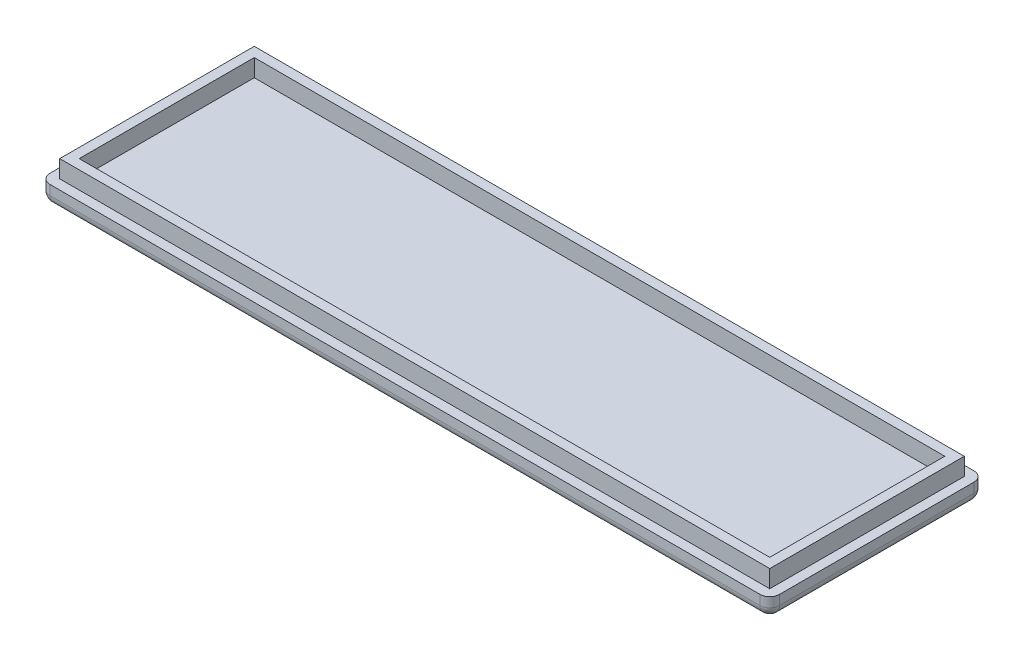
ISO-10303-21;
HEADER;
FILE_DESCRIPTION(('STEP AP214'),'2;1');
FILE_NAME('part.step','',(''),(''),'','','');
FILE_SCHEMA(('AUTOMOTIVE_DESIGN { 1 0 10303 214 1 1 1 1 }'));
ENDSEC;
DATA;
#1=APPLICATION_CONTEXT('core data for automotive mechanical design processes');
#2=APPLICATION_PROTOCOL_DEFINITION('international standard','automotive_design',2000,#1);
#3=PRODUCT_CONTEXT('',#1,'mechanical');
#4=PRODUCT('Part','Part','',(#3));
#5=PRODUCT_RELATED_PRODUCT_CATEGORY('part','',(#4));
#6=PRODUCT_DEFINITION_FORMATION('','',#4);
#7=PRODUCT_DEFINITION_CONTEXT('part definition',#1,'design');
#8=PRODUCT_DEFINITION('design','',#6,#7);
#9=PRODUCT_DEFINITION_SHAPE('','',#8);
#10=(LENGTH_UNIT() NAMED_UNIT(*) SI_UNIT(.MILLI.,.METRE.));
#11=(NAMED_UNIT(*) PLANE_ANGLE_UNIT() SI_UNIT($,.RADIAN.));
#12=(NAMED_UNIT(*) SI_UNIT($,.STERADIAN.) SOLID_ANGLE_UNIT());
#13=UNCERTAINTY_MEASURE_WITH_UNIT(LENGTH_MEASURE(1.E-05),#10,'distance_accuracy_value','');
#14=(GEOMETRIC_REPRESENTATION_CONTEXT(3) GLOBAL_UNCERTAINTY_ASSIGNED_CONTEXT((#13)) GLOBAL_UNIT_ASSIGNED_CONTEXT((#10,
#11,#12)) REPRESENTATION_CONTEXT('',''));
#15=CARTESIAN_POINT('',(0.,0.,0.));
#16=DIRECTION('',(0.,0.,1.));
#17=DIRECTION('',(1.,0.,0.));
#18=AXIS2_PLACEMENT_3D('',#15,#16,#17);
#19=CARTESIAN_POINT('',(0.,2.,0.));
#20=DIRECTION('',(0.,-1.,0.));
#21=DIRECTION('',(0.,0.,-1.));
#22=AXIS2_PLACEMENT_3D('',#19,#20,#21);
#23=PLANE('',#22);
#24=DIRECTION('',(1.,0.,0.));
#25=VECTOR('',#24,1.);
#26=CARTESIAN_POINT('',(-37.5,2.,11.));
#27=LINE('',#26,#25);
#28=CARTESIAN_POINT('',(-36.5,2.,11.));
#29=VERTEX_POINT('',#28);
#30=CARTESIAN_POINT('',(36.5,2.,11.));
#31=VERTEX_POINT('',#30);
#32=EDGE_CURVE('E281',#29,#31,#27,.T.);
#33=ORIENTED_EDGE('',*,*,#32,.T.);
#34=CARTESIAN_POINT('',(36.5,2.,10.));
#35=DIRECTION('',(0.,-1.,0.));
#36=DIRECTION('',(0.,0.,-1.));
#37=AXIS2_PLACEMENT_3D('',#34,#35,#36);
#38=CIRCLE('',#37,1.);
#39=CARTESIAN_POINT('',(37.5,2.,10.));
#40=VERTEX_POINT('',#39);
#41=EDGE_CURVE('E11',#31,#40,#38,.F.);
#42=ORIENTED_EDGE('',*,*,#41,.T.);
#43=DIRECTION('',(0.,0.,-1.));
#44=VECTOR('',#43,1.);
#45=CARTESIAN_POINT('',(37.5,2.,11.));
#46=LINE('',#45,#44);
#47=CARTESIAN_POINT('',(37.5,2.,-10.));
#48=VERTEX_POINT('',#47);
#49=EDGE_CURVE('E269',#40,#48,#46,.T.);
#50=ORIENTED_EDGE('',*,*,#49,.T.);
#51=CARTESIAN_POINT('',(36.5,2.,-10.));
#52=DIRECTION('',(0.,-1.,0.));
#53=DIRECTION('',(0.,0.,-1.));
#54=AXIS2_PLACEMENT_3D('',#51,#52,#53);
#55=CIRCLE('',#54,1.);
#56=CARTESIAN_POINT('',(36.5,2.,-11.));
#57=VERTEX_POINT('',#56);
#58=EDGE_CURVE('E53',#48,#57,#55,.F.);
#59=ORIENTED_EDGE('',*,*,#58,.T.);
#60=DIRECTION('',(-1.,0.,0.));
#61=VECTOR('',#60,1.);
#62=CARTESIAN_POINT('',(-37.5,2.,-11.));
#63=LINE('',#62,#61);
#64=CARTESIAN_POINT('',(-36.5,2.,-11.));
#65=VERTEX_POINT('',#64);
#66=EDGE_CURVE('E273',#57,#65,#63,.T.);
#67=ORIENTED_EDGE('',*,*,#66,.T.);
#68=CARTESIAN_POINT('',(-36.5,2.,-10.));
#69=DIRECTION('',(0.,-1.,0.));
#70=DIRECTION('',(0.,0.,-1.));
#71=AXIS2_PLACEMENT_3D('',#68,#69,#70);
#72=CIRCLE('',#71,1.);
#73=CARTESIAN_POINT('',(-37.5,2.,-10.));
#74=VERTEX_POINT('',#73);
#75=EDGE_CURVE('E336',#65,#74,#72,.F.);
#76=ORIENTED_EDGE('',*,*,#75,.T.);
#77=DIRECTION('',(0.,0.,1.));
#78=VECTOR('',#77,1.);
#79=CARTESIAN_POINT('',(-37.5,2.,11.));
#80=LINE('',#79,#78);
#81=CARTESIAN_POINT('',(-37.5,2.,10.));
#82=VERTEX_POINT('',#81);
#83=EDGE_CURVE('E277',#74,#82,#80,.T.);
#84=ORIENTED_EDGE('',*,*,#83,.T.);
#85=CARTESIAN_POINT('',(-36.5,2.,10.));
#86=DIRECTION('',(0.,-1.,0.));
#87=DIRECTION('',(0.,0.,-1.));
#88=AXIS2_PLACEMENT_3D('',#85,#86,#87);
#89=CIRCLE('',#88,1.);
#90=EDGE_CURVE('E333',#82,#29,#89,.F.);
#91=ORIENTED_EDGE('',*,*,#90,.T.);
#92=EDGE_LOOP('',(#33,#42,#50,#59,#67,#76,#84,#91));
#93=FACE_BOUND('',#92,.T.);
#94=DIRECTION('',(0.,0.,-1.));
#95=VECTOR('',#94,1.);
#96=CARTESIAN_POINT('',(36.5,2.,10.));
#97=LINE('',#96,#95);
#98=CARTESIAN_POINT('',(36.5,2.,10.));
#99=VERTEX_POINT('',#98);
#100=CARTESIAN_POINT('',(36.5,2.,-10.));
#101=VERTEX_POINT('',#100);
#102=EDGE_CURVE('E191',#99,#101,#97,.T.);
#103=ORIENTED_EDGE('',*,*,#102,.F.);
#104=DIRECTION('',(1.,0.,0.));
#105=VECTOR('',#104,1.);
#106=CARTESIAN_POINT('',(-36.5,2.,10.));
#107=LINE('',#106,#105);
#108=CARTESIAN_POINT('',(-36.5,2.,10.));
#109=VERTEX_POINT('',#108);
#110=EDGE_CURVE('E230',#109,#99,#107,.T.);
#111=ORIENTED_EDGE('',*,*,#110,.F.);
#112=DIRECTION('',(0.,0.,1.));
#113=VECTOR('',#112,1.);
#114=CARTESIAN_POINT('',(-36.5,2.,10.));
#115=LINE('',#114,#113);
#116=CARTESIAN_POINT('',(-36.5,2.,-10.));
#117=VERTEX_POINT('',#116);
#118=EDGE_CURVE('E247',#117,#109,#115,.T.);
#119=ORIENTED_EDGE('',*,*,#118,.F.);
#120=DIRECTION('',(-1.,0.,0.));
#121=VECTOR('',#120,1.);
#122=CARTESIAN_POINT('',(-36.5,2.,-10.));
#123=LINE('',#122,#121);
#124=EDGE_CURVE('E243',#101,#117,#123,.T.);
#125=ORIENTED_EDGE('',*,*,#124,.F.);
#126=EDGE_LOOP('',(#103,#111,#119,#125));
#127=FACE_BOUND('',#126,.T.);
#128=ADVANCED_FACE('F43',(#93,#127),#23,.F.);
#129=CARTESIAN_POINT('',(37.5,2.,11.));
#130=DIRECTION('',(-1.,0.,0.));
#131=DIRECTION('',(0.,0.,1.));
#132=AXIS2_PLACEMENT_3D('',#129,#130,#131);
#133=PLANE('',#132);
#134=ORIENTED_EDGE('',*,*,#49,.F.);
#135=DIRECTION('',(0.,-1.,0.));
#136=VECTOR('',#135,1.);
#137=CARTESIAN_POINT('',(37.5,2.,10.));
#138=LINE('',#137,#136);
#139=CARTESIAN_POINT('',(37.5,1.,10.));
#140=VERTEX_POINT('',#139);
#141=EDGE_CURVE('E61',#40,#140,#138,.T.);
#142=ORIENTED_EDGE('',*,*,#141,.T.);
#143=DIRECTION('',(0.,0.,-1.));
#144=VECTOR('',#143,1.);
#145=CARTESIAN_POINT('',(37.5,1.,-11.));
#146=LINE('',#145,#144);
#147=CARTESIAN_POINT('',(37.5,1.,-10.));
#148=VERTEX_POINT('',#147);
#149=EDGE_CURVE('E66',#140,#148,#146,.T.);
#150=ORIENTED_EDGE('',*,*,#149,.T.);
#151=DIRECTION('',(0.,-1.,0.));
#152=VECTOR('',#151,1.);
#153=CARTESIAN_POINT('',(37.5,2.,-10.));
#154=LINE('',#153,#152);
#155=EDGE_CURVE('E326',#148,#48,#154,.F.);
#156=ORIENTED_EDGE('',*,*,#155,.T.);
#157=EDGE_LOOP('',(#134,#142,#150,#156));
#158=FACE_BOUND('',#157,.T.);
#159=ADVANCED_FACE('F403',(#158),#133,.F.);
#160=CARTESIAN_POINT('',(-37.5,2.,-11.));
#161=DIRECTION('',(0.,0.,1.));
#162=DIRECTION('',(1.,0.,0.));
#163=AXIS2_PLACEMENT_3D('',#160,#161,#162);
#164=PLANE('',#163);
#165=ORIENTED_EDGE('',*,*,#66,.F.);
#166=DIRECTION('',(0.,-1.,0.));
#167=VECTOR('',#166,1.);
#168=CARTESIAN_POINT('',(36.5,2.,-11.));
#169=LINE('',#168,#167);
#170=CARTESIAN_POINT('',(36.5,1.,-11.));
#171=VERTEX_POINT('',#170);
#172=EDGE_CURVE('E292',#57,#171,#169,.T.);
#173=ORIENTED_EDGE('',*,*,#172,.T.);
#174=DIRECTION('',(-1.,0.,0.));
#175=VECTOR('',#174,1.);
#176=CARTESIAN_POINT('',(-37.5,1.,-11.));
#177=LINE('',#176,#175);
#178=CARTESIAN_POINT('',(-36.5,1.,-11.));
#179=VERTEX_POINT('',#178);
#180=EDGE_CURVE('E288',#171,#179,#177,.T.);
#181=ORIENTED_EDGE('',*,*,#180,.T.);
#182=DIRECTION('',(0.,-1.,0.));
#183=VECTOR('',#182,1.);
#184=CARTESIAN_POINT('',(-36.5,2.,-11.));
#185=LINE('',#184,#183);
#186=EDGE_CURVE('E285',#179,#65,#185,.F.);
#187=ORIENTED_EDGE('',*,*,#186,.T.);
#188=EDGE_LOOP('',(#165,#173,#181,#187));
#189=FACE_BOUND('',#188,.T.);
#190=ADVANCED_FACE('F444',(#189),#164,.F.);
#191=CARTESIAN_POINT('',(-37.5,2.,11.));
#192=DIRECTION('',(1.,0.,0.));
#193=DIRECTION('',(0.,0.,-1.));
#194=AXIS2_PLACEMENT_3D('',#191,#192,#193);
#195=PLANE('',#194);
#196=ORIENTED_EDGE('',*,*,#83,.F.);
#197=DIRECTION('',(0.,-1.,0.));
#198=VECTOR('',#197,1.);
#199=CARTESIAN_POINT('',(-37.5,2.,-10.));
#200=LINE('',#199,#198);
#201=CARTESIAN_POINT('',(-37.5,1.,-10.));
#202=VERTEX_POINT('',#201);
#203=EDGE_CURVE('E314',#74,#202,#200,.T.);
#204=ORIENTED_EDGE('',*,*,#203,.T.);
#205=DIRECTION('',(0.,0.,1.));
#206=VECTOR('',#205,1.);
#207=CARTESIAN_POINT('',(-37.5,1.,11.));
#208=LINE('',#207,#206);
#209=CARTESIAN_POINT('',(-37.5,1.,10.));
#210=VERTEX_POINT('',#209);
#211=EDGE_CURVE('E311',#202,#210,#208,.T.);
#212=ORIENTED_EDGE('',*,*,#211,.T.);
#213=DIRECTION('',(0.,-1.,0.));
#214=VECTOR('',#213,1.);
#215=CARTESIAN_POINT('',(-37.5,2.,10.));
#216=LINE('',#215,#214);
#217=EDGE_CURVE('E308',#210,#82,#216,.F.);
#218=ORIENTED_EDGE('',*,*,#217,.T.);
#219=EDGE_LOOP('',(#196,#204,#212,#218));
#220=FACE_BOUND('',#219,.T.);
#221=ADVANCED_FACE('F447',(#220),#195,.F.);
#222=CARTESIAN_POINT('',(-37.5,2.,11.));
#223=DIRECTION('',(0.,0.,-1.));
#224=DIRECTION('',(-1.,0.,0.));
#225=AXIS2_PLACEMENT_3D('',#222,#223,#224);
#226=PLANE('',#225);
#227=DIRECTION('',(1.,0.,0.));
#228=VECTOR('',#227,1.);
#229=CARTESIAN_POINT('',(37.5,1.,11.));
#230=LINE('',#229,#228);
#231=CARTESIAN_POINT('',(-36.5,1.,11.));
#232=VERTEX_POINT('',#231);
#233=CARTESIAN_POINT('',(36.5,1.,11.));
#234=VERTEX_POINT('',#233);
#235=EDGE_CURVE('E320',#232,#234,#230,.T.);
#236=ORIENTED_EDGE('',*,*,#235,.T.);
#237=DIRECTION('',(0.,-1.,0.));
#238=VECTOR('',#237,1.);
#239=CARTESIAN_POINT('',(36.5,2.,11.));
#240=LINE('',#239,#238);
#241=EDGE_CURVE('E323',#234,#31,#240,.F.);
#242=ORIENTED_EDGE('',*,*,#241,.T.);
#243=ORIENTED_EDGE('',*,*,#32,.F.);
#244=DIRECTION('',(0.,-1.,0.));
#245=VECTOR('',#244,1.);
#246=CARTESIAN_POINT('',(-36.5,2.,11.));
#247=LINE('',#246,#245);
#248=EDGE_CURVE('E317',#29,#232,#247,.T.);
#249=ORIENTED_EDGE('',*,*,#248,.T.);
#250=EDGE_LOOP('',(#236,#242,#243,#249));
#251=FACE_BOUND('',#250,.T.);
#252=ADVANCED_FACE('F412',(#251),#226,.F.);
#253=CARTESIAN_POINT('',(0.,0.,0.));
#254=DIRECTION('',(0.,-1.,0.));
#255=DIRECTION('',(0.,0.,-1.));
#256=AXIS2_PLACEMENT_3D('',#253,#254,#255);
#257=PLANE('',#256);
#258=DIRECTION('',(0.,0.,1.));
#259=VECTOR('',#258,1.);
#260=CARTESIAN_POINT('',(-36.5,0.,-11.));
#261=LINE('',#260,#259);
#262=CARTESIAN_POINT('',(-36.5,0.,10.));
#263=VERTEX_POINT('',#262);
#264=CARTESIAN_POINT('',(-36.5,0.,-10.));
#265=VERTEX_POINT('',#264);
#266=EDGE_CURVE('E301',#263,#265,#261,.F.);
#267=ORIENTED_EDGE('',*,*,#266,.T.);
#268=DIRECTION('',(-1.,0.,0.));
#269=VECTOR('',#268,1.);
#270=CARTESIAN_POINT('',(37.5,0.,-10.));
#271=LINE('',#270,#269);
#272=CARTESIAN_POINT('',(36.5,0.,-10.));
#273=VERTEX_POINT('',#272);
#274=EDGE_CURVE('E304',#265,#273,#271,.F.);
#275=ORIENTED_EDGE('',*,*,#274,.T.);
#276=DIRECTION('',(0.,0.,-1.));
#277=VECTOR('',#276,1.);
#278=CARTESIAN_POINT('',(36.5,0.,11.));
#279=LINE('',#278,#277);
#280=CARTESIAN_POINT('',(36.5,0.,10.));
#281=VERTEX_POINT('',#280);
#282=EDGE_CURVE('E295',#273,#281,#279,.F.);
#283=ORIENTED_EDGE('',*,*,#282,.T.);
#284=DIRECTION('',(1.,0.,0.));
#285=VECTOR('',#284,1.);
#286=CARTESIAN_POINT('',(-37.5,0.,10.));
#287=LINE('',#286,#285);
#288=EDGE_CURVE('E298',#281,#263,#287,.F.);
#289=ORIENTED_EDGE('',*,*,#288,.T.);
#290=EDGE_LOOP('',(#267,#275,#283,#289));
#291=FACE_BOUND('',#290,.T.);
#292=ADVANCED_FACE('F431',(#291),#257,.T.);
#293=CARTESIAN_POINT('',(0.,3.8,0.));
#294=DIRECTION('',(0.,-1.,0.));
#295=DIRECTION('',(0.,0.,-1.));
#296=AXIS2_PLACEMENT_3D('',#293,#294,#295);
#297=PLANE('',#296);
#298=DIRECTION('',(0.,0.,-1.));
#299=VECTOR('',#298,1.);
#300=CARTESIAN_POINT('',(36.5,3.8,10.));
#301=LINE('',#300,#299);
#302=CARTESIAN_POINT('',(36.5,3.8,10.));
#303=VERTEX_POINT('',#302);
#304=CARTESIAN_POINT('',(36.5,3.8,-10.));
#305=VERTEX_POINT('',#304);
#306=EDGE_CURVE('E225',#303,#305,#301,.T.);
#307=ORIENTED_EDGE('',*,*,#306,.T.);
#308=DIRECTION('',(-1.,0.,0.));
#309=VECTOR('',#308,1.);
#310=CARTESIAN_POINT('',(-36.5,3.8,-10.));
#311=LINE('',#310,#309);
#312=CARTESIAN_POINT('',(-36.5,3.8,-10.));
#313=VERTEX_POINT('',#312);
#314=EDGE_CURVE('E229',#305,#313,#311,.T.);
#315=ORIENTED_EDGE('',*,*,#314,.T.);
#316=DIRECTION('',(0.,0.,1.));
#317=VECTOR('',#316,1.);
#318=CARTESIAN_POINT('',(-36.5,3.8,10.));
#319=LINE('',#318,#317);
#320=CARTESIAN_POINT('',(-36.5,3.8,10.));
#321=VERTEX_POINT('',#320);
#322=EDGE_CURVE('E233',#313,#321,#319,.T.);
#323=ORIENTED_EDGE('',*,*,#322,.T.);
#324=DIRECTION('',(1.,0.,0.));
#325=VECTOR('',#324,1.);
#326=CARTESIAN_POINT('',(-36.5,3.8,10.));
#327=LINE('',#326,#325);
#328=EDGE_CURVE('E236',#321,#303,#327,.T.);
#329=ORIENTED_EDGE('',*,*,#328,.T.);
#330=EDGE_LOOP('',(#307,#315,#323,#329));
#331=FACE_BOUND('',#330,.T.);
#332=DIRECTION('',(0.,0.,-1.));
#333=VECTOR('',#332,1.);
#334=CARTESIAN_POINT('',(35.5,3.8,9.));
#335=LINE('',#334,#333);
#336=CARTESIAN_POINT('',(35.5,3.8,9.));
#337=VERTEX_POINT('',#336);
#338=CARTESIAN_POINT('',(35.5,3.8,-9.));
#339=VERTEX_POINT('',#338);
#340=EDGE_CURVE('E171',#337,#339,#335,.T.);
#341=ORIENTED_EDGE('',*,*,#340,.F.);
#342=DIRECTION('',(1.,0.,0.));
#343=VECTOR('',#342,1.);
#344=CARTESIAN_POINT('',(-35.5,3.8,9.));
#345=LINE('',#344,#343);
#346=CARTESIAN_POINT('',(-35.5,3.8,9.));
#347=VERTEX_POINT('',#346);
#348=EDGE_CURVE('E201',#347,#337,#345,.T.);
#349=ORIENTED_EDGE('',*,*,#348,.F.);
#350=DIRECTION('',(0.,0.,1.));
#351=VECTOR('',#350,1.);
#352=CARTESIAN_POINT('',(-35.5,3.8,9.));
#353=LINE('',#352,#351);
#354=CARTESIAN_POINT('',(-35.5,3.8,-9.));
#355=VERTEX_POINT('',#354);
#356=EDGE_CURVE('E197',#355,#347,#353,.T.);
#357=ORIENTED_EDGE('',*,*,#356,.F.);
#358=DIRECTION('',(-1.,0.,0.));
#359=VECTOR('',#358,1.);
#360=CARTESIAN_POINT('',(-35.5,3.8,-9.));
#361=LINE('',#360,#359);
#362=EDGE_CURVE('E182',#339,#355,#361,.T.);
#363=ORIENTED_EDGE('',*,*,#362,.F.);
#364=EDGE_LOOP('',(#341,#349,#357,#363));
#365=FACE_BOUND('',#364,.T.);
#366=ADVANCED_FACE('F195',(#331,#365),#297,.F.);
#367=CARTESIAN_POINT('',(36.5,3.8,10.));
#368=DIRECTION('',(-1.,0.,0.));
#369=DIRECTION('',(0.,0.,1.));
#370=AXIS2_PLACEMENT_3D('',#367,#368,#369);
#371=PLANE('',#370);
#372=ORIENTED_EDGE('',*,*,#102,.T.);
#373=DIRECTION('',(0.,-1.,0.));
#374=VECTOR('',#373,1.);
#375=CARTESIAN_POINT('',(36.5,3.8,-10.));
#376=LINE('',#375,#374);
#377=EDGE_CURVE('E265',#305,#101,#376,.T.);
#378=ORIENTED_EDGE('',*,*,#377,.F.);
#379=ORIENTED_EDGE('',*,*,#306,.F.);
#380=DIRECTION('',(0.,-1.,0.));
#381=VECTOR('',#380,1.);
#382=CARTESIAN_POINT('',(36.5,3.8,10.));
#383=LINE('',#382,#381);
#384=EDGE_CURVE('E239',#303,#99,#383,.T.);
#385=ORIENTED_EDGE('',*,*,#384,.T.);
#386=EDGE_LOOP('',(#372,#378,#379,#385));
#387=FACE_BOUND('',#386,.T.);
#388=ADVANCED_FACE('F490',(#387),#371,.F.);
#389=CARTESIAN_POINT('',(-36.5,3.8,-10.));
#390=DIRECTION('',(0.,0.,1.));
#391=DIRECTION('',(1.,0.,0.));
#392=AXIS2_PLACEMENT_3D('',#389,#390,#391);
#393=PLANE('',#392);
#394=ORIENTED_EDGE('',*,*,#124,.T.);
#395=DIRECTION('',(0.,-1.,0.));
#396=VECTOR('',#395,1.);
#397=CARTESIAN_POINT('',(-36.5,3.8,-10.));
#398=LINE('',#397,#396);
#399=EDGE_CURVE('E261',#313,#117,#398,.T.);
#400=ORIENTED_EDGE('',*,*,#399,.F.);
#401=ORIENTED_EDGE('',*,*,#314,.F.);
#402=ORIENTED_EDGE('',*,*,#377,.T.);
#403=EDGE_LOOP('',(#394,#400,#401,#402));
#404=FACE_BOUND('',#403,.T.);
#405=ADVANCED_FACE('F498',(#404),#393,.F.);
#406=CARTESIAN_POINT('',(-36.5,3.8,10.));
#407=DIRECTION('',(1.,0.,0.));
#408=DIRECTION('',(0.,0.,-1.));
#409=AXIS2_PLACEMENT_3D('',#406,#407,#408);
#410=PLANE('',#409);
#411=ORIENTED_EDGE('',*,*,#118,.T.);
#412=DIRECTION('',(0.,-1.,0.));
#413=VECTOR('',#412,1.);
#414=CARTESIAN_POINT('',(-36.5,3.8,10.));
#415=LINE('',#414,#413);
#416=EDGE_CURVE('E257',#321,#109,#415,.T.);
#417=ORIENTED_EDGE('',*,*,#416,.F.);
#418=ORIENTED_EDGE('',*,*,#322,.F.);
#419=ORIENTED_EDGE('',*,*,#399,.T.);
#420=EDGE_LOOP('',(#411,#417,#418,#419));
#421=FACE_BOUND('',#420,.T.);
#422=ADVANCED_FACE('F494',(#421),#410,.F.);
#423=CARTESIAN_POINT('',(-36.5,3.8,10.));
#424=DIRECTION('',(0.,0.,-1.));
#425=DIRECTION('',(-1.,0.,0.));
#426=AXIS2_PLACEMENT_3D('',#423,#424,#425);
#427=PLANE('',#426);
#428=ORIENTED_EDGE('',*,*,#110,.T.);
#429=ORIENTED_EDGE('',*,*,#384,.F.);
#430=ORIENTED_EDGE('',*,*,#328,.F.);
#431=ORIENTED_EDGE('',*,*,#416,.T.);
#432=EDGE_LOOP('',(#428,#429,#430,#431));
#433=FACE_BOUND('',#432,.T.);
#434=ADVANCED_FACE('F487',(#433),#427,.F.);
#435=CARTESIAN_POINT('',(35.5,3.8,9.));
#436=DIRECTION('',(-1.,0.,0.));
#437=DIRECTION('',(0.,0.,1.));
#438=AXIS2_PLACEMENT_3D('',#435,#436,#437);
#439=PLANE('',#438);
#440=DIRECTION('',(0.,0.,-1.));
#441=VECTOR('',#440,1.);
#442=CARTESIAN_POINT('',(35.5,2.,9.));
#443=LINE('',#442,#441);
#444=CARTESIAN_POINT('',(35.5,2.,9.));
#445=VERTEX_POINT('',#444);
#446=CARTESIAN_POINT('',(35.5,2.,-9.));
#447=VERTEX_POINT('',#446);
#448=EDGE_CURVE('E206',#445,#447,#443,.T.);
#449=ORIENTED_EDGE('',*,*,#448,.F.);
#450=DIRECTION('',(0.,-1.,0.));
#451=VECTOR('',#450,1.);
#452=CARTESIAN_POINT('',(35.5,3.8,9.));
#453=LINE('',#452,#451);
#454=EDGE_CURVE('E177',#337,#445,#453,.T.);
#455=ORIENTED_EDGE('',*,*,#454,.F.);
#456=ORIENTED_EDGE('',*,*,#340,.T.);
#457=DIRECTION('',(0.,-1.,0.));
#458=VECTOR('',#457,1.);
#459=CARTESIAN_POINT('',(35.5,3.8,-9.));
#460=LINE('',#459,#458);
#461=EDGE_CURVE('E175',#339,#447,#460,.T.);
#462=ORIENTED_EDGE('',*,*,#461,.T.);
#463=EDGE_LOOP('',(#449,#455,#456,#462));
#464=FACE_BOUND('',#463,.T.);
#465=ADVANCED_FACE('F174',(#464),#439,.T.);
#466=CARTESIAN_POINT('',(-35.5,3.8,-9.));
#467=DIRECTION('',(0.,0.,1.));
#468=DIRECTION('',(1.,0.,0.));
#469=AXIS2_PLACEMENT_3D('',#466,#467,#468);
#470=PLANE('',#469);
#471=DIRECTION('',(-1.,0.,0.));
#472=VECTOR('',#471,1.);
#473=CARTESIAN_POINT('',(-35.5,2.,-9.));
#474=LINE('',#473,#472);
#475=CARTESIAN_POINT('',(-35.5,2.,-9.));
#476=VERTEX_POINT('',#475);
#477=EDGE_CURVE('E189',#447,#476,#474,.T.);
#478=ORIENTED_EDGE('',*,*,#477,.F.);
#479=ORIENTED_EDGE('',*,*,#461,.F.);
#480=ORIENTED_EDGE('',*,*,#362,.T.);
#481=DIRECTION('',(0.,-1.,0.));
#482=VECTOR('',#481,1.);
#483=CARTESIAN_POINT('',(-35.5,3.8,-9.));
#484=LINE('',#483,#482);
#485=EDGE_CURVE('E192',#355,#476,#484,.T.);
#486=ORIENTED_EDGE('',*,*,#485,.T.);
#487=EDGE_LOOP('',(#478,#479,#480,#486));
#488=FACE_BOUND('',#487,.T.);
#489=ADVANCED_FACE('F186',(#488),#470,.T.);
#490=CARTESIAN_POINT('',(-35.5,3.8,9.));
#491=DIRECTION('',(1.,0.,0.));
#492=DIRECTION('',(0.,0.,-1.));
#493=AXIS2_PLACEMENT_3D('',#490,#491,#492);
#494=PLANE('',#493);
#495=DIRECTION('',(0.,0.,1.));
#496=VECTOR('',#495,1.);
#497=CARTESIAN_POINT('',(-35.5,2.,9.));
#498=LINE('',#497,#496);
#499=CARTESIAN_POINT('',(-35.5,2.,9.));
#500=VERTEX_POINT('',#499);
#501=EDGE_CURVE('E211',#476,#500,#498,.T.);
#502=ORIENTED_EDGE('',*,*,#501,.F.);
#503=ORIENTED_EDGE('',*,*,#485,.F.);
#504=ORIENTED_EDGE('',*,*,#356,.T.);
#505=DIRECTION('',(0.,-1.,0.));
#506=VECTOR('',#505,1.);
#507=CARTESIAN_POINT('',(-35.5,3.8,9.));
#508=LINE('',#507,#506);
#509=EDGE_CURVE('E220',#347,#500,#508,.T.);
#510=ORIENTED_EDGE('',*,*,#509,.T.);
#511=EDGE_LOOP('',(#502,#503,#504,#510));
#512=FACE_BOUND('',#511,.T.);
#513=ADVANCED_FACE('F472',(#512),#494,.T.);
#514=CARTESIAN_POINT('',(-35.5,3.8,9.));
#515=DIRECTION('',(0.,0.,-1.));
#516=DIRECTION('',(-1.,0.,0.));
#517=AXIS2_PLACEMENT_3D('',#514,#515,#516);
#518=PLANE('',#517);
#519=DIRECTION('',(1.,0.,0.));
#520=VECTOR('',#519,1.);
#521=CARTESIAN_POINT('',(-35.5,2.,9.));
#522=LINE('',#521,#520);
#523=EDGE_CURVE('E183',#500,#445,#522,.T.);
#524=ORIENTED_EDGE('',*,*,#523,.F.);
#525=ORIENTED_EDGE('',*,*,#509,.F.);
#526=ORIENTED_EDGE('',*,*,#348,.T.);
#527=ORIENTED_EDGE('',*,*,#454,.T.);
#528=EDGE_LOOP('',(#524,#525,#526,#527));
#529=FACE_BOUND('',#528,.T.);
#530=ADVANCED_FACE('F466',(#529),#518,.T.);
#531=ORIENTED_EDGE('',*,*,#523,.T.);
#532=ORIENTED_EDGE('',*,*,#448,.T.);
#533=ORIENTED_EDGE('',*,*,#477,.T.);
#534=ORIENTED_EDGE('',*,*,#501,.T.);
#535=EDGE_LOOP('',(#531,#532,#533,#534));
#536=FACE_BOUND('',#535,.T.);
#537=ADVANCED_FACE('F458',(#536),#23,.F.);
#538=CARTESIAN_POINT('',(36.5,2.,10.));
#539=DIRECTION('',(0.,-1.,0.));
#540=DIRECTION('',(0.,0.,-1.));
#541=AXIS2_PLACEMENT_3D('',#538,#539,#540);
#542=CYLINDRICAL_SURFACE('',#541,1.);
#543=ORIENTED_EDGE('',*,*,#41,.F.);
#544=ORIENTED_EDGE('',*,*,#241,.F.);
#545=CARTESIAN_POINT('',(36.5,1.,10.));
#546=DIRECTION('',(0.,-1.,0.));
#547=DIRECTION('',(0.,0.,-1.));
#548=AXIS2_PLACEMENT_3D('',#545,#546,#547);
#549=CIRCLE('',#548,1.);
#550=EDGE_CURVE('E378',#140,#234,#549,.T.);
#551=ORIENTED_EDGE('',*,*,#550,.F.);
#552=ORIENTED_EDGE('',*,*,#141,.F.);
#553=EDGE_LOOP('',(#543,#544,#551,#552));
#554=FACE_BOUND('',#553,.T.);
#555=ADVANCED_FACE('F45',(#554),#542,.T.);
#556=CARTESIAN_POINT('',(-36.5,2.,10.));
#557=DIRECTION('',(0.,-1.,0.));
#558=DIRECTION('',(0.,0.,-1.));
#559=AXIS2_PLACEMENT_3D('',#556,#557,#558);
#560=CYLINDRICAL_SURFACE('',#559,1.);
#561=ORIENTED_EDGE('',*,*,#90,.F.);
#562=ORIENTED_EDGE('',*,*,#217,.F.);
#563=CARTESIAN_POINT('',(-36.5,1.,10.));
#564=DIRECTION('',(0.,-1.,0.));
#565=DIRECTION('',(0.,0.,-1.));
#566=AXIS2_PLACEMENT_3D('',#563,#564,#565);
#567=CIRCLE('',#566,1.);
#568=EDGE_CURVE('E375',#232,#210,#567,.T.);
#569=ORIENTED_EDGE('',*,*,#568,.F.);
#570=ORIENTED_EDGE('',*,*,#248,.F.);
#571=EDGE_LOOP('',(#561,#562,#569,#570));
#572=FACE_BOUND('',#571,.T.);
#573=ADVANCED_FACE('F421',(#572),#560,.T.);
#574=CARTESIAN_POINT('',(-37.5,1.,10.));
#575=DIRECTION('',(-1.,0.,0.));
#576=DIRECTION('',(0.,0.,1.));
#577=AXIS2_PLACEMENT_3D('',#574,#575,#576);
#578=CYLINDRICAL_SURFACE('',#577,1.);
#579=CARTESIAN_POINT('',(36.5,1.,10.));
#580=DIRECTION('',(1.,0.,0.));
#581=DIRECTION('',(0.,0.,-1.));
#582=AXIS2_PLACEMENT_3D('',#579,#580,#581);
#583=CIRCLE('',#582,1.);
#584=EDGE_CURVE('E47',#234,#281,#583,.T.);
#585=ORIENTED_EDGE('',*,*,#584,.F.);
#586=ORIENTED_EDGE('',*,*,#235,.F.);
#587=CARTESIAN_POINT('',(-36.5,1.,10.));
#588=DIRECTION('',(-1.,0.,0.));
#589=DIRECTION('',(0.,0.,1.));
#590=AXIS2_PLACEMENT_3D('',#587,#588,#589);
#591=CIRCLE('',#590,1.);
#592=EDGE_CURVE('E371',#263,#232,#591,.T.);
#593=ORIENTED_EDGE('',*,*,#592,.F.);
#594=ORIENTED_EDGE('',*,*,#288,.F.);
#595=EDGE_LOOP('',(#585,#586,#593,#594));
#596=FACE_BOUND('',#595,.T.);
#597=ADVANCED_FACE('F416',(#596),#578,.T.);
#598=CARTESIAN_POINT('',(36.5,1.,10.));
#599=DIRECTION('',(0.,0.,1.));
#600=DIRECTION('',(1.,0.,0.));
#601=AXIS2_PLACEMENT_3D('',#598,#599,#600);
#602=SPHERICAL_SURFACE('',#601,1.);
#603=ORIENTED_EDGE('',*,*,#550,.T.);
#604=ORIENTED_EDGE('',*,*,#584,.T.);
#605=CARTESIAN_POINT('',(36.5,1.,10.));
#606=DIRECTION('',(0.,0.,1.));
#607=DIRECTION('',(1.,0.,0.));
#608=AXIS2_PLACEMENT_3D('',#605,#606,#607);
#609=CIRCLE('',#608,1.);
#610=EDGE_CURVE('E367',#140,#281,#609,.F.);
#611=ORIENTED_EDGE('',*,*,#610,.F.);
#612=EDGE_LOOP('',(#603,#604,#611));
#613=FACE_BOUND('',#612,.T.);
#614=ADVANCED_FACE('F386',(#613),#602,.T.);
#615=CARTESIAN_POINT('',(-36.5,1.,10.));
#616=DIRECTION('',(0.,0.,1.));
#617=DIRECTION('',(1.,0.,0.));
#618=AXIS2_PLACEMENT_3D('',#615,#616,#617);
#619=SPHERICAL_SURFACE('',#618,1.);
#620=ORIENTED_EDGE('',*,*,#592,.T.);
#621=ORIENTED_EDGE('',*,*,#568,.T.);
#622=CARTESIAN_POINT('',(-36.5,1.,10.));
#623=DIRECTION('',(0.,0.,1.));
#624=DIRECTION('',(1.,0.,0.));
#625=AXIS2_PLACEMENT_3D('',#622,#623,#624);
#626=CIRCLE('',#625,1.);
#627=EDGE_CURVE('E363',#263,#210,#626,.F.);
#628=ORIENTED_EDGE('',*,*,#627,.F.);
#629=EDGE_LOOP('',(#620,#621,#628));
#630=FACE_BOUND('',#629,.T.);
#631=ADVANCED_FACE('F423',(#630),#619,.T.);
#632=CARTESIAN_POINT('',(36.5,1.,11.));
#633=DIRECTION('',(0.,0.,1.));
#634=DIRECTION('',(1.,0.,0.));
#635=AXIS2_PLACEMENT_3D('',#632,#633,#634);
#636=CYLINDRICAL_SURFACE('',#635,1.);
#637=ORIENTED_EDGE('',*,*,#610,.T.);
#638=ORIENTED_EDGE('',*,*,#282,.F.);
#639=CARTESIAN_POINT('',(36.5,1.,-10.));
#640=DIRECTION('',(0.,0.,-1.));
#641=DIRECTION('',(-1.,0.,0.));
#642=AXIS2_PLACEMENT_3D('',#639,#640,#641);
#643=CIRCLE('',#642,1.);
#644=EDGE_CURVE('E359',#148,#273,#643,.T.);
#645=ORIENTED_EDGE('',*,*,#644,.F.);
#646=ORIENTED_EDGE('',*,*,#149,.F.);
#647=EDGE_LOOP('',(#637,#638,#645,#646));
#648=FACE_BOUND('',#647,.T.);
#649=ADVANCED_FACE('F392',(#648),#636,.T.);
#650=CARTESIAN_POINT('',(36.5,2.,-10.));
#651=DIRECTION('',(0.,-1.,0.));
#652=DIRECTION('',(0.,0.,-1.));
#653=AXIS2_PLACEMENT_3D('',#650,#651,#652);
#654=CYLINDRICAL_SURFACE('',#653,1.);
#655=ORIENTED_EDGE('',*,*,#58,.F.);
#656=ORIENTED_EDGE('',*,*,#155,.F.);
#657=CARTESIAN_POINT('',(36.5,1.,-10.));
#658=DIRECTION('',(0.,-1.,0.));
#659=DIRECTION('',(0.,0.,-1.));
#660=AXIS2_PLACEMENT_3D('',#657,#658,#659);
#661=CIRCLE('',#660,1.);
#662=EDGE_CURVE('E355',#171,#148,#661,.T.);
#663=ORIENTED_EDGE('',*,*,#662,.F.);
#664=ORIENTED_EDGE('',*,*,#172,.F.);
#665=EDGE_LOOP('',(#655,#656,#663,#664));
#666=FACE_BOUND('',#665,.T.);
#667=ADVANCED_FACE('F402',(#666),#654,.T.);
#668=CARTESIAN_POINT('',(-36.5,2.,-10.));
#669=DIRECTION('',(0.,-1.,0.));
#670=DIRECTION('',(0.,0.,-1.));
#671=AXIS2_PLACEMENT_3D('',#668,#669,#670);
#672=CYLINDRICAL_SURFACE('',#671,1.);
#673=ORIENTED_EDGE('',*,*,#75,.F.);
#674=ORIENTED_EDGE('',*,*,#186,.F.);
#675=CARTESIAN_POINT('',(-36.5,1.,-10.));
#676=DIRECTION('',(0.,-1.,0.));
#677=DIRECTION('',(0.,0.,-1.));
#678=AXIS2_PLACEMENT_3D('',#675,#676,#677);
#679=CIRCLE('',#678,1.);
#680=EDGE_CURVE('E351',#202,#179,#679,.T.);
#681=ORIENTED_EDGE('',*,*,#680,.F.);
#682=ORIENTED_EDGE('',*,*,#203,.F.);
#683=EDGE_LOOP('',(#673,#674,#681,#682));
#684=FACE_BOUND('',#683,.T.);
#685=ADVANCED_FACE('F442',(#684),#672,.T.);
#686=CARTESIAN_POINT('',(-36.5,1.,11.));
#687=DIRECTION('',(0.,0.,-1.));
#688=DIRECTION('',(-1.,0.,0.));
#689=AXIS2_PLACEMENT_3D('',#686,#687,#688);
#690=CYLINDRICAL_SURFACE('',#689,1.);
#691=ORIENTED_EDGE('',*,*,#627,.T.);
#692=ORIENTED_EDGE('',*,*,#211,.F.);
#693=CARTESIAN_POINT('',(-36.5,1.,-10.));
#694=DIRECTION('',(0.,0.,-1.));
#695=DIRECTION('',(-1.,0.,0.));
#696=AXIS2_PLACEMENT_3D('',#693,#694,#695);
#697=CIRCLE('',#696,1.);
#698=EDGE_CURVE('E347',#265,#202,#697,.T.);
#699=ORIENTED_EDGE('',*,*,#698,.F.);
#700=ORIENTED_EDGE('',*,*,#266,.F.);
#701=EDGE_LOOP('',(#691,#692,#699,#700));
#702=FACE_BOUND('',#701,.T.);
#703=ADVANCED_FACE('F428',(#702),#690,.T.);
#704=CARTESIAN_POINT('',(36.5,1.,-10.));
#705=DIRECTION('',(1.,0.,0.));
#706=DIRECTION('',(0.,0.,-1.));
#707=AXIS2_PLACEMENT_3D('',#704,#705,#706);
#708=SPHERICAL_SURFACE('',#707,1.);
#709=ORIENTED_EDGE('',*,*,#662,.T.);
#710=ORIENTED_EDGE('',*,*,#644,.T.);
#711=CARTESIAN_POINT('',(36.5,1.,-10.));
#712=DIRECTION('',(1.,0.,0.));
#713=DIRECTION('',(0.,0.,-1.));
#714=AXIS2_PLACEMENT_3D('',#711,#712,#713);
#715=CIRCLE('',#714,1.);
#716=EDGE_CURVE('E344',#171,#273,#715,.F.);
#717=ORIENTED_EDGE('',*,*,#716,.F.);
#718=EDGE_LOOP('',(#709,#710,#717));
#719=FACE_BOUND('',#718,.T.);
#720=ADVANCED_FACE('F397',(#719),#708,.T.);
#721=CARTESIAN_POINT('',(-36.5,1.,-10.));
#722=DIRECTION('',(-1.,0.,0.));
#723=DIRECTION('',(0.,0.,1.));
#724=AXIS2_PLACEMENT_3D('',#721,#722,#723);
#725=SPHERICAL_SURFACE('',#724,1.);
#726=ORIENTED_EDGE('',*,*,#698,.T.);
#727=ORIENTED_EDGE('',*,*,#680,.T.);
#728=CARTESIAN_POINT('',(-36.5,1.,-10.));
#729=DIRECTION('',(-1.,0.,0.));
#730=DIRECTION('',(0.,0.,1.));
#731=AXIS2_PLACEMENT_3D('',#728,#729,#730);
#732=CIRCLE('',#731,1.);
#733=EDGE_CURVE('E341',#265,#179,#732,.F.);
#734=ORIENTED_EDGE('',*,*,#733,.F.);
#735=EDGE_LOOP('',(#726,#727,#734));
#736=FACE_BOUND('',#735,.T.);
#737=ADVANCED_FACE('F436',(#736),#725,.T.);
#738=CARTESIAN_POINT('',(-37.5,1.,-10.));
#739=DIRECTION('',(1.,0.,0.));
#740=DIRECTION('',(0.,0.,-1.));
#741=AXIS2_PLACEMENT_3D('',#738,#739,#740);
#742=CYLINDRICAL_SURFACE('',#741,1.);
#743=ORIENTED_EDGE('',*,*,#716,.T.);
#744=ORIENTED_EDGE('',*,*,#274,.F.);
#745=ORIENTED_EDGE('',*,*,#733,.T.);
#746=ORIENTED_EDGE('',*,*,#180,.F.);
#747=EDGE_LOOP('',(#743,#744,#745,#746));
#748=FACE_BOUND('',#747,.T.);
#749=ADVANCED_FACE('F434',(#748),#742,.T.);
#750=CLOSED_SHELL('',(#128,#159,#190,#221,#252,#292,#366,#388,#405,#422,#434,#465,#489,#513,
#530,#537,#555,#573,#597,#614,#631,#649,#667,#685,#703,#720,#737,#749));
#751=MANIFOLD_SOLID_BREP('B2',#750);
#752=ADVANCED_BREP_SHAPE_REPRESENTATION('',(#18,#751),#14);
#753=SHAPE_DEFINITION_REPRESENTATION(#9,#752);
ENDSEC;
END-ISO-10303-21;
